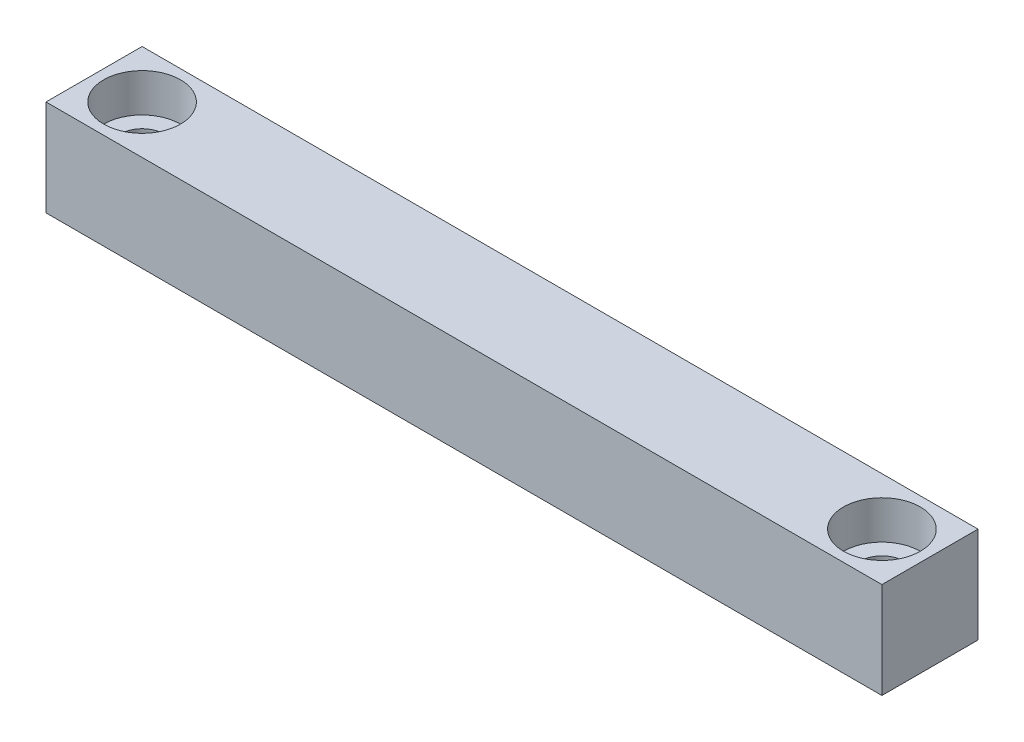
ISO-10303-21;
HEADER;
FILE_DESCRIPTION(('STEP AP214'),'2;1');
FILE_NAME('part.step','',(''),(''),'','','');
FILE_SCHEMA(('AUTOMOTIVE_DESIGN { 1 0 10303 214 1 1 1 1 }'));
ENDSEC;
DATA;
#1=APPLICATION_CONTEXT('core data for automotive mechanical design processes');
#2=APPLICATION_PROTOCOL_DEFINITION('international standard','automotive_design',2000,#1);
#3=PRODUCT_CONTEXT('',#1,'mechanical');
#4=PRODUCT('Part','Part','',(#3));
#5=PRODUCT_RELATED_PRODUCT_CATEGORY('part','',(#4));
#6=PRODUCT_DEFINITION_FORMATION('','',#4);
#7=PRODUCT_DEFINITION_CONTEXT('part definition',#1,'design');
#8=PRODUCT_DEFINITION('design','',#6,#7);
#9=PRODUCT_DEFINITION_SHAPE('','',#8);
#10=(LENGTH_UNIT() NAMED_UNIT(*) SI_UNIT(.MILLI.,.METRE.));
#11=(NAMED_UNIT(*) PLANE_ANGLE_UNIT() SI_UNIT($,.RADIAN.));
#12=(NAMED_UNIT(*) SI_UNIT($,.STERADIAN.) SOLID_ANGLE_UNIT());
#13=UNCERTAINTY_MEASURE_WITH_UNIT(LENGTH_MEASURE(1.E-05),#10,'distance_accuracy_value','');
#14=(GEOMETRIC_REPRESENTATION_CONTEXT(3) GLOBAL_UNCERTAINTY_ASSIGNED_CONTEXT((#13)) GLOBAL_UNIT_ASSIGNED_CONTEXT((#10,
#11,#12)) REPRESENTATION_CONTEXT('',''));
#15=CARTESIAN_POINT('',(0.,0.,0.));
#16=DIRECTION('',(0.,0.,1.));
#17=DIRECTION('',(1.,0.,0.));
#18=AXIS2_PLACEMENT_3D('',#15,#16,#17);
#19=CARTESIAN_POINT('',(43.5,10.,5.));
#20=DIRECTION('',(-1.,0.,0.));
#21=DIRECTION('',(0.,0.,1.));
#22=AXIS2_PLACEMENT_3D('',#19,#20,#21);
#23=PLANE('',#22);
#24=DIRECTION('',(0.,0.,-1.));
#25=VECTOR('',#24,1.);
#26=CARTESIAN_POINT('',(43.5,0.,5.));
#27=LINE('',#26,#25);
#28=CARTESIAN_POINT('',(43.5,0.,5.));
#29=VERTEX_POINT('',#28);
#30=CARTESIAN_POINT('',(43.5,0.,-5.));
#31=VERTEX_POINT('',#30);
#32=EDGE_CURVE('E105',#29,#31,#27,.T.);
#33=ORIENTED_EDGE('',*,*,#32,.T.);
#34=DIRECTION('',(0.,-1.,0.));
#35=VECTOR('',#34,1.);
#36=CARTESIAN_POINT('',(43.5,10.,-5.));
#37=LINE('',#36,#35);
#38=CARTESIAN_POINT('',(43.5,10.,-5.));
#39=VERTEX_POINT('',#38);
#40=EDGE_CURVE('E11',#39,#31,#37,.T.);
#41=ORIENTED_EDGE('',*,*,#40,.F.);
#42=DIRECTION('',(0.,0.,-1.));
#43=VECTOR('',#42,1.);
#44=CARTESIAN_POINT('',(43.5,10.,5.));
#45=LINE('',#44,#43);
#46=CARTESIAN_POINT('',(43.5,10.,5.));
#47=VERTEX_POINT('',#46);
#48=EDGE_CURVE('E89',#47,#39,#45,.T.);
#49=ORIENTED_EDGE('',*,*,#48,.F.);
#50=DIRECTION('',(0.,-1.,0.));
#51=VECTOR('',#50,1.);
#52=CARTESIAN_POINT('',(43.5,10.,5.));
#53=LINE('',#52,#51);
#54=EDGE_CURVE('E98',#47,#29,#53,.T.);
#55=ORIENTED_EDGE('',*,*,#54,.T.);
#56=EDGE_LOOP('',(#33,#41,#49,#55));
#57=FACE_BOUND('',#56,.T.);
#58=ADVANCED_FACE('F39',(#57),#23,.F.);
#59=CARTESIAN_POINT('',(-43.5,10.,-5.));
#60=DIRECTION('',(0.,0.,1.));
#61=DIRECTION('',(1.,0.,0.));
#62=AXIS2_PLACEMENT_3D('',#59,#60,#61);
#63=PLANE('',#62);
#64=DIRECTION('',(-1.,0.,0.));
#65=VECTOR('',#64,1.);
#66=CARTESIAN_POINT('',(-43.5,0.,-5.));
#67=LINE('',#66,#65);
#68=CARTESIAN_POINT('',(-43.5,0.,-5.));
#69=VERTEX_POINT('',#68);
#70=EDGE_CURVE('E94',#31,#69,#67,.T.);
#71=ORIENTED_EDGE('',*,*,#70,.T.);
#72=DIRECTION('',(0.,-1.,0.));
#73=VECTOR('',#72,1.);
#74=CARTESIAN_POINT('',(-43.5,10.,-5.));
#75=LINE('',#74,#73);
#76=CARTESIAN_POINT('',(-43.5,10.,-5.));
#77=VERTEX_POINT('',#76);
#78=EDGE_CURVE('E50',#77,#69,#75,.T.);
#79=ORIENTED_EDGE('',*,*,#78,.F.);
#80=DIRECTION('',(-1.,0.,0.));
#81=VECTOR('',#80,1.);
#82=CARTESIAN_POINT('',(-43.5,10.,-5.));
#83=LINE('',#82,#81);
#84=EDGE_CURVE('E84',#39,#77,#83,.T.);
#85=ORIENTED_EDGE('',*,*,#84,.F.);
#86=ORIENTED_EDGE('',*,*,#40,.T.);
#87=EDGE_LOOP('',(#71,#79,#85,#86));
#88=FACE_BOUND('',#87,.T.);
#89=ADVANCED_FACE('F91',(#88),#63,.F.);
#90=CARTESIAN_POINT('',(-43.5,10.,5.));
#91=DIRECTION('',(1.,0.,0.));
#92=DIRECTION('',(0.,0.,-1.));
#93=AXIS2_PLACEMENT_3D('',#90,#91,#92);
#94=PLANE('',#93);
#95=DIRECTION('',(0.,0.,1.));
#96=VECTOR('',#95,1.);
#97=CARTESIAN_POINT('',(-43.5,0.,5.));
#98=LINE('',#97,#96);
#99=CARTESIAN_POINT('',(-43.5,0.,5.));
#100=VERTEX_POINT('',#99);
#101=EDGE_CURVE('E75',#69,#100,#98,.T.);
#102=ORIENTED_EDGE('',*,*,#101,.T.);
#103=DIRECTION('',(0.,-1.,0.));
#104=VECTOR('',#103,1.);
#105=CARTESIAN_POINT('',(-43.5,10.,5.));
#106=LINE('',#105,#104);
#107=CARTESIAN_POINT('',(-43.5,10.,5.));
#108=VERTEX_POINT('',#107);
#109=EDGE_CURVE('E92',#108,#100,#106,.T.);
#110=ORIENTED_EDGE('',*,*,#109,.F.);
#111=DIRECTION('',(0.,0.,1.));
#112=VECTOR('',#111,1.);
#113=CARTESIAN_POINT('',(-43.5,10.,5.));
#114=LINE('',#113,#112);
#115=EDGE_CURVE('E86',#77,#108,#114,.T.);
#116=ORIENTED_EDGE('',*,*,#115,.F.);
#117=ORIENTED_EDGE('',*,*,#78,.T.);
#118=EDGE_LOOP('',(#102,#110,#116,#117));
#119=FACE_BOUND('',#118,.T.);
#120=ADVANCED_FACE('F96',(#119),#94,.F.);
#121=CARTESIAN_POINT('',(-43.5,10.,5.));
#122=DIRECTION('',(0.,0.,-1.));
#123=DIRECTION('',(-1.,0.,0.));
#124=AXIS2_PLACEMENT_3D('',#121,#122,#123);
#125=PLANE('',#124);
#126=DIRECTION('',(1.,0.,0.));
#127=VECTOR('',#126,1.);
#128=CARTESIAN_POINT('',(-43.5,0.,5.));
#129=LINE('',#128,#127);
#130=EDGE_CURVE('E77',#100,#29,#129,.T.);
#131=ORIENTED_EDGE('',*,*,#130,.T.);
#132=ORIENTED_EDGE('',*,*,#54,.F.);
#133=DIRECTION('',(1.,0.,0.));
#134=VECTOR('',#133,1.);
#135=CARTESIAN_POINT('',(-43.5,10.,5.));
#136=LINE('',#135,#134);
#137=EDGE_CURVE('E54',#108,#47,#136,.T.);
#138=ORIENTED_EDGE('',*,*,#137,.F.);
#139=ORIENTED_EDGE('',*,*,#109,.T.);
#140=EDGE_LOOP('',(#131,#132,#138,#139));
#141=FACE_BOUND('',#140,.T.);
#142=ADVANCED_FACE('F109',(#141),#125,.F.);
#143=CARTESIAN_POINT('',(0.,10.,0.));
#144=DIRECTION('',(0.,-1.,0.));
#145=DIRECTION('',(0.,0.,-1.));
#146=AXIS2_PLACEMENT_3D('',#143,#144,#145);
#147=PLANE('',#146);
#148=CARTESIAN_POINT('',(38.5,10.,0.));
#149=DIRECTION('',(0.,1.,0.));
#150=DIRECTION('',(0.,0.,1.));
#151=AXIS2_PLACEMENT_3D('',#148,#149,#150);
#152=CIRCLE('',#151,3.99999999999999);
#153=CARTESIAN_POINT('',(38.5,10.,3.99999999999999));
#154=VERTEX_POINT('',#153);
#155=EDGE_CURVE('E136',#154,#154,#152,.T.);
#156=ORIENTED_EDGE('',*,*,#155,.F.);
#157=EDGE_LOOP('',(#156));
#158=FACE_BOUND('',#157,.T.);
#159=CARTESIAN_POINT('',(-38.5,10.,0.));
#160=DIRECTION('',(0.,1.,0.));
#161=DIRECTION('',(0.,0.,1.));
#162=AXIS2_PLACEMENT_3D('',#159,#160,#161);
#163=CIRCLE('',#162,3.99999999999999);
#164=CARTESIAN_POINT('',(-38.5,10.,3.99999999999999));
#165=VERTEX_POINT('',#164);
#166=EDGE_CURVE('E123',#165,#165,#163,.T.);
#167=ORIENTED_EDGE('',*,*,#166,.F.);
#168=EDGE_LOOP('',(#167));
#169=FACE_BOUND('',#168,.T.);
#170=ORIENTED_EDGE('',*,*,#48,.T.);
#171=ORIENTED_EDGE('',*,*,#84,.T.);
#172=ORIENTED_EDGE('',*,*,#115,.T.);
#173=ORIENTED_EDGE('',*,*,#137,.T.);
#174=EDGE_LOOP('',(#170,#171,#172,#173));
#175=FACE_BOUND('',#174,.T.);
#176=ADVANCED_FACE('F88',(#158,#169,#175),#147,.F.);
#177=CARTESIAN_POINT('',(0.,0.,0.));
#178=DIRECTION('',(0.,-1.,0.));
#179=DIRECTION('',(0.,0.,-1.));
#180=AXIS2_PLACEMENT_3D('',#177,#178,#179);
#181=PLANE('',#180);
#182=CARTESIAN_POINT('',(38.5,0.,0.));
#183=DIRECTION('',(0.,1.,0.));
#184=DIRECTION('',(0.,0.,1.));
#185=AXIS2_PLACEMENT_3D('',#182,#183,#184);
#186=CIRCLE('',#185,2.25);
#187=CARTESIAN_POINT('',(38.5,0.,2.25));
#188=VERTEX_POINT('',#187);
#189=EDGE_CURVE('E130',#188,#188,#186,.T.);
#190=ORIENTED_EDGE('',*,*,#189,.T.);
#191=EDGE_LOOP('',(#190));
#192=FACE_BOUND('',#191,.T.);
#193=CARTESIAN_POINT('',(-38.5,0.,0.));
#194=DIRECTION('',(0.,1.,0.));
#195=DIRECTION('',(0.,0.,1.));
#196=AXIS2_PLACEMENT_3D('',#193,#194,#195);
#197=CIRCLE('',#196,2.25);
#198=CARTESIAN_POINT('',(-38.5,0.,2.25));
#199=VERTEX_POINT('',#198);
#200=EDGE_CURVE('E104',#199,#199,#197,.T.);
#201=ORIENTED_EDGE('',*,*,#200,.T.);
#202=EDGE_LOOP('',(#201));
#203=FACE_BOUND('',#202,.T.);
#204=ORIENTED_EDGE('',*,*,#32,.F.);
#205=ORIENTED_EDGE('',*,*,#130,.F.);
#206=ORIENTED_EDGE('',*,*,#101,.F.);
#207=ORIENTED_EDGE('',*,*,#70,.F.);
#208=EDGE_LOOP('',(#204,#205,#206,#207));
#209=FACE_BOUND('',#208,.T.);
#210=ADVANCED_FACE('F114',(#192,#203,#209),#181,.T.);
#211=CARTESIAN_POINT('',(-38.5,10.,0.));
#212=DIRECTION('',(0.,1.,0.));
#213=DIRECTION('',(0.,0.,1.));
#214=AXIS2_PLACEMENT_3D('',#211,#212,#213);
#215=CYLINDRICAL_SURFACE('',#214,2.25);
#216=ORIENTED_EDGE('',*,*,#200,.F.);
#217=EDGE_LOOP('',(#216));
#218=FACE_BOUND('',#217,.T.);
#219=CARTESIAN_POINT('',(-38.5,6.,0.));
#220=DIRECTION('',(0.,1.,0.));
#221=DIRECTION('',(0.,0.,1.));
#222=AXIS2_PLACEMENT_3D('',#219,#220,#221);
#223=CIRCLE('',#222,2.25);
#224=CARTESIAN_POINT('',(-38.5,6.,2.25));
#225=VERTEX_POINT('',#224);
#226=EDGE_CURVE('E117',#225,#225,#223,.T.);
#227=ORIENTED_EDGE('',*,*,#226,.T.);
#228=EDGE_LOOP('',(#227));
#229=FACE_BOUND('',#228,.T.);
#230=ADVANCED_FACE('F159',(#218,#229),#215,.F.);
#231=CARTESIAN_POINT('',(-36.25,6.,0.));
#232=DIRECTION('',(0.,-1.,0.));
#233=DIRECTION('',(0.,0.,-1.));
#234=AXIS2_PLACEMENT_3D('',#231,#232,#233);
#235=PLANE('',#234);
#236=ORIENTED_EDGE('',*,*,#226,.F.);
#237=EDGE_LOOP('',(#236));
#238=FACE_BOUND('',#237,.T.);
#239=CARTESIAN_POINT('',(-38.5,6.,0.));
#240=DIRECTION('',(0.,1.,0.));
#241=DIRECTION('',(0.,0.,1.));
#242=AXIS2_PLACEMENT_3D('',#239,#240,#241);
#243=CIRCLE('',#242,4.);
#244=CARTESIAN_POINT('',(-38.5,6.,4.));
#245=VERTEX_POINT('',#244);
#246=EDGE_CURVE('E121',#245,#245,#243,.T.);
#247=ORIENTED_EDGE('',*,*,#246,.T.);
#248=EDGE_LOOP('',(#247));
#249=FACE_BOUND('',#248,.T.);
#250=ADVANCED_FACE('F147',(#238,#249),#235,.F.);
#251=CARTESIAN_POINT('',(-38.5,10.,0.));
#252=DIRECTION('',(0.,1.,0.));
#253=DIRECTION('',(0.,0.,1.));
#254=AXIS2_PLACEMENT_3D('',#251,#252,#253);
#255=CYLINDRICAL_SURFACE('',#254,3.99999999999999);
#256=ORIENTED_EDGE('',*,*,#246,.F.);
#257=EDGE_LOOP('',(#256));
#258=FACE_BOUND('',#257,.T.);
#259=ORIENTED_EDGE('',*,*,#166,.T.);
#260=EDGE_LOOP('',(#259));
#261=FACE_BOUND('',#260,.T.);
#262=ADVANCED_FACE('F150',(#258,#261),#255,.F.);
#263=CARTESIAN_POINT('',(38.5,10.,0.));
#264=DIRECTION('',(0.,1.,0.));
#265=DIRECTION('',(0.,0.,1.));
#266=AXIS2_PLACEMENT_3D('',#263,#264,#265);
#267=CYLINDRICAL_SURFACE('',#266,2.25);
#268=ORIENTED_EDGE('',*,*,#189,.F.);
#269=EDGE_LOOP('',(#268));
#270=FACE_BOUND('',#269,.T.);
#271=CARTESIAN_POINT('',(38.5,6.,0.));
#272=DIRECTION('',(0.,1.,0.));
#273=DIRECTION('',(0.,0.,1.));
#274=AXIS2_PLACEMENT_3D('',#271,#272,#273);
#275=CIRCLE('',#274,2.25);
#276=CARTESIAN_POINT('',(38.5,6.,2.25));
#277=VERTEX_POINT('',#276);
#278=EDGE_CURVE('E128',#277,#277,#275,.T.);
#279=ORIENTED_EDGE('',*,*,#278,.T.);
#280=EDGE_LOOP('',(#279));
#281=FACE_BOUND('',#280,.T.);
#282=ADVANCED_FACE('F149',(#270,#281),#267,.F.);
#283=CARTESIAN_POINT('',(40.75,6.,0.));
#284=DIRECTION('',(0.,-1.,0.));
#285=DIRECTION('',(0.,0.,-1.));
#286=AXIS2_PLACEMENT_3D('',#283,#284,#285);
#287=PLANE('',#286);
#288=ORIENTED_EDGE('',*,*,#278,.F.);
#289=EDGE_LOOP('',(#288));
#290=FACE_BOUND('',#289,.T.);
#291=CARTESIAN_POINT('',(38.5,6.,0.));
#292=DIRECTION('',(0.,1.,0.));
#293=DIRECTION('',(0.,0.,1.));
#294=AXIS2_PLACEMENT_3D('',#291,#292,#293);
#295=CIRCLE('',#294,4.);
#296=CARTESIAN_POINT('',(38.5,6.,4.));
#297=VERTEX_POINT('',#296);
#298=EDGE_CURVE('E132',#297,#297,#295,.T.);
#299=ORIENTED_EDGE('',*,*,#298,.T.);
#300=EDGE_LOOP('',(#299));
#301=FACE_BOUND('',#300,.T.);
#302=ADVANCED_FACE('F160',(#290,#301),#287,.F.);
#303=CARTESIAN_POINT('',(38.5,10.,0.));
#304=DIRECTION('',(0.,1.,0.));
#305=DIRECTION('',(0.,0.,1.));
#306=AXIS2_PLACEMENT_3D('',#303,#304,#305);
#307=CYLINDRICAL_SURFACE('',#306,3.99999999999999);
#308=ORIENTED_EDGE('',*,*,#298,.F.);
#309=EDGE_LOOP('',(#308));
#310=FACE_BOUND('',#309,.T.);
#311=ORIENTED_EDGE('',*,*,#155,.T.);
#312=EDGE_LOOP('',(#311));
#313=FACE_BOUND('',#312,.T.);
#314=ADVANCED_FACE('F139',(#310,#313),#307,.F.);
#315=CLOSED_SHELL('',(#58,#89,#120,#142,#176,#210,#230,#250,#262,#282,#302,#314));
#316=MANIFOLD_SOLID_BREP('B2',#315);
#317=ADVANCED_BREP_SHAPE_REPRESENTATION('',(#18,#316),#14);
#318=SHAPE_DEFINITION_REPRESENTATION(#9,#317);
ENDSEC;
END-ISO-10303-21;
